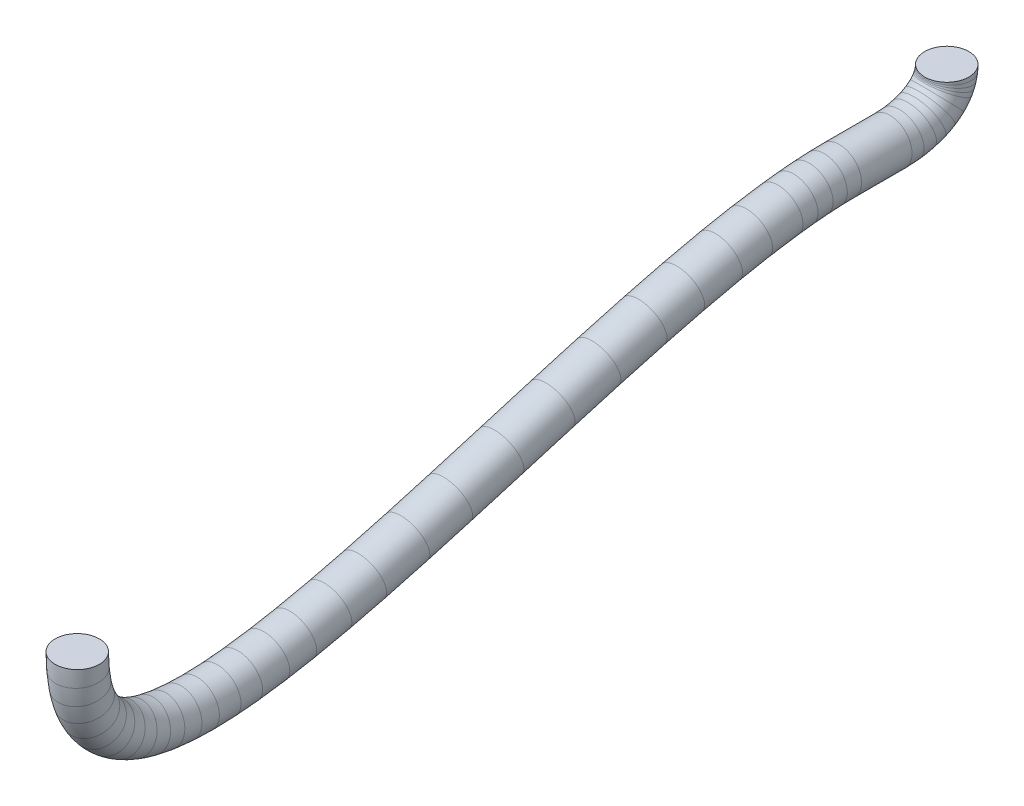
ISO-10303-21;
HEADER;
FILE_DESCRIPTION(('STEP AP214'),'2;1');
FILE_NAME('part.step','',(''),(''),'','','');
FILE_SCHEMA(('AUTOMOTIVE_DESIGN { 1 0 10303 214 1 1 1 1 }'));
ENDSEC;
DATA;
#1=APPLICATION_CONTEXT('core data for automotive mechanical design processes');
#2=APPLICATION_PROTOCOL_DEFINITION('international standard','automotive_design',2000,#1);
#3=PRODUCT_CONTEXT('',#1,'mechanical');
#4=PRODUCT('Part','Part','',(#3));
#5=PRODUCT_RELATED_PRODUCT_CATEGORY('part','',(#4));
#6=PRODUCT_DEFINITION_FORMATION('','',#4);
#7=PRODUCT_DEFINITION_CONTEXT('part definition',#1,'design');
#8=PRODUCT_DEFINITION('design','',#6,#7);
#9=PRODUCT_DEFINITION_SHAPE('','',#8);
#10=(LENGTH_UNIT() NAMED_UNIT(*) SI_UNIT(.MILLI.,.METRE.));
#11=(NAMED_UNIT(*) PLANE_ANGLE_UNIT() SI_UNIT($,.RADIAN.));
#12=(NAMED_UNIT(*) SI_UNIT($,.STERADIAN.) SOLID_ANGLE_UNIT());
#13=UNCERTAINTY_MEASURE_WITH_UNIT(LENGTH_MEASURE(1.E-05),#10,'distance_accuracy_value','');
#14=(GEOMETRIC_REPRESENTATION_CONTEXT(3) GLOBAL_UNCERTAINTY_ASSIGNED_CONTEXT((#13)) GLOBAL_UNIT_ASSIGNED_CONTEXT((#10,
#11,#12)) REPRESENTATION_CONTEXT('',''));
#15=CARTESIAN_POINT('',(0.,0.,0.));
#16=DIRECTION('',(0.,0.,1.));
#17=DIRECTION('',(1.,0.,0.));
#18=AXIS2_PLACEMENT_3D('',#15,#16,#17);
#19=CARTESIAN_POINT('',(0.599683531625097,-230.95,225.510489149716));
#20=DIRECTION('',(0.,-1.,0.));
#21=DIRECTION('',(0.,0.,-1.));
#22=AXIS2_PLACEMENT_3D('',#19,#20,#21);
#23=PLANE('',#22);
#24=CARTESIAN_POINT('',(0.599683531625097,-230.95,225.510489149716));
#25=DIRECTION('',(0.,1.,0.));
#26=DIRECTION('',(0.,0.,-1.));
#27=AXIS2_PLACEMENT_3D('',#24,#25,#26);
#28=CIRCLE('',#27,1.75);
#29=CARTESIAN_POINT('',(0.599683531625097,-230.95,223.760489149716));
#30=VERTEX_POINT('',#29);
#31=EDGE_CURVE('E11',#30,#30,#28,.T.);
#32=ORIENTED_EDGE('',*,*,#31,.T.);
#33=EDGE_LOOP('',(#32));
#34=FACE_BOUND('',#33,.T.);
#35=ADVANCED_FACE('F43',(#34),#23,.F.);
#36=CARTESIAN_POINT('',(0.652273653358251,-230.950000000005,211.445726271844));
#37=DIRECTION('',(0.999993009488198,0.,0.00373911416480584));
#38=DIRECTION('',(-0.00373911416480584,0.,0.999993009488198));
#39=AXIS2_PLACEMENT_3D('',#36,#37,#38);
#40=TOROIDAL_SURFACE('',#39,14.0648611984503,1.75);
#41=ORIENTED_EDGE('',*,*,#31,.F.);
#42=EDGE_LOOP('',(#41));
#43=FACE_BOUND('',#42,.T.);
#44=CARTESIAN_POINT('',(0.599876661505989,-232.154270391325,225.458838271379));
#45=DIRECTION('',(-0.000320152784654025,0.996327639592214,0.0856220303823781));
#46=DIRECTION('',(-1.37312788296879E-05,0.0856220303823781,-0.996327690935393));
#47=AXIS2_PLACEMENT_3D('',#44,#45,#46);
#48=CIRCLE('',#47,1.75);
#49=CARTESIAN_POINT('',(0.599852631768037,-232.004431838156,223.715264812242));
#50=VERTEX_POINT('',#49);
#51=EDGE_CURVE('E53',#50,#50,#48,.T.);
#52=ORIENTED_EDGE('',*,*,#51,.T.);
#53=EDGE_LOOP('',(#52));
#54=FACE_BOUND('',#53,.T.);
#55=ADVANCED_FACE('F310',(#43,#54),#40,.T.);
#56=CARTESIAN_POINT('',(0.637481512229634,-231.277168882739,215.252721544967));
#57=DIRECTION('',(-0.999993210663899,-4.65774382858567E-06,-0.00368491579451425));
#58=DIRECTION('',(0.00368491579455422,0.,-0.999993210674746));
#59=AXIS2_PLACEMENT_3D('',#56,#57,#58);
#60=TOROIDAL_SURFACE('',#59,10.2438049480803,1.75);
#61=CARTESIAN_POINT('',(0.600521501898247,-233.346108992383,225.285351339525));
#62=DIRECTION('',(-0.000748803744928628,0.979391732372712,0.201968497179461));
#63=DIRECTION('',(-7.66801555379996E-05,0.201968496973167,-0.979392015666124));
#64=AXIS2_PLACEMENT_3D('',#61,#62,#63);
#65=CIRCLE('',#64,1.75);
#66=CARTESIAN_POINT('',(0.600387311626055,-232.992664122679,223.571415312109));
#67=VERTEX_POINT('',#66);
#68=EDGE_CURVE('E221',#67,#67,#65,.T.);
#69=ORIENTED_EDGE('',*,*,#68,.T.);
#70=EDGE_LOOP('',(#69));
#71=FACE_BOUND('',#70,.T.);
#72=ORIENTED_EDGE('',*,*,#51,.F.);
#73=EDGE_LOOP('',(#72));
#74=FACE_BOUND('',#73,.T.);
#75=ADVANCED_FACE('F316',(#71,#74),#60,.T.);
#76=CARTESIAN_POINT('',(0.631750574026379,-231.584244505673,216.741780676299));
#77=DIRECTION('',(-0.999993311714176,-1.03364423971567E-05,-0.00365737885266748));
#78=DIRECTION('',(0.00365737885286286,0.,-0.999993311767597));
#79=AXIS2_PLACEMENT_3D('',#76,#77,#78);
#80=TOROIDAL_SURFACE('',#79,8.7234019397249,1.75);
#81=CARTESIAN_POINT('',(0.601714966366488,-234.50311305654,224.962306550417));
#82=DIRECTION('',(-0.00123350720030742,0.94235950622106,0.334599819926412));
#83=DIRECTION('',(-0.000213491057720491,0.334599818690996,-0.942360289779615));
#84=AXIS2_PLACEMENT_3D('',#81,#82,#83);
#85=CIRCLE('',#84,1.75);
#86=CARTESIAN_POINT('',(0.601341357015477,-233.91756337383,223.313176043303));
#87=VERTEX_POINT('',#86);
#88=EDGE_CURVE('E220',#87,#87,#85,.T.);
#89=ORIENTED_EDGE('',*,*,#88,.T.);
#90=EDGE_LOOP('',(#89));
#91=FACE_BOUND('',#90,.T.);
#92=ORIENTED_EDGE('',*,*,#68,.F.);
#93=EDGE_LOOP('',(#92));
#94=FACE_BOUND('',#93,.T.);
#95=ADVANCED_FACE('F586',(#91,#94),#80,.T.);
#96=CARTESIAN_POINT('',(0.624426582612896,-232.255162773185,218.631312993528));
#97=DIRECTION('',(-0.999993525080731,-3.12614918615267E-05,-0.00359844679437807));
#98=DIRECTION('',(0.00359844679613642,0.,-0.999993525569369));
#99=AXIS2_PLACEMENT_3D('',#96,#97,#98);
#100=TOROIDAL_SURFACE('',#99,6.71827922248788,1.75);
#101=CARTESIAN_POINT('',(0.603550296161072,-235.592963501449,224.461744040233));
#102=DIRECTION('',(-0.0018149240154829,0.867851457829194,0.49682044361576));
#103=DIRECTION('',(-0.000486673799911577,0.496820436476968,-0.867853223216603));
#104=AXIS2_PLACEMENT_3D('',#101,#102,#103);
#105=CIRCLE('',#104,1.75);
#106=CARTESIAN_POINT('',(0.602698617011227,-234.723527737614,222.943000899604));
#107=VERTEX_POINT('',#106);
#108=EDGE_CURVE('E222',#107,#107,#105,.T.);
#109=ORIENTED_EDGE('',*,*,#108,.T.);
#110=EDGE_LOOP('',(#109));
#111=FACE_BOUND('',#110,.T.);
#112=ORIENTED_EDGE('',*,*,#88,.F.);
#113=EDGE_LOOP('',(#112));
#114=FACE_BOUND('',#113,.T.);
#115=ADVANCED_FACE('F579',(#111,#114),#100,.T.);
#116=CARTESIAN_POINT('',(0.622465015387702,-232.535265784044,219.120592871893));
#117=DIRECTION('',(-0.999993630358914,-4.81866480562204E-05,-0.00356888212852284));
#118=DIRECTION('',(0.00356888213266623,0.,-0.999993631519883));
#119=AXIS2_PLACEMENT_3D('',#116,#117,#118);
#120=TOROIDAL_SURFACE('',#119,6.1544917662376,1.75);
#121=CARTESIAN_POINT('',(0.605871285254258,-236.504911050862,223.823720555088));
#122=DIRECTION('',(-0.00233875103817929,0.764182831932174,0.644995449304647));
#123=DIRECTION('',(-0.000863792573269664,0.644995428858808,-0.764185939816765));
#124=AXIS2_PLACEMENT_3D('',#121,#122,#123);
#125=CIRCLE('',#124,1.75);
#126=CARTESIAN_POINT('',(0.604359648251036,-235.376169050359,222.486395160409));
#127=VERTEX_POINT('',#126);
#128=EDGE_CURVE('E47',#127,#127,#125,.T.);
#129=ORIENTED_EDGE('',*,*,#128,.T.);
#130=EDGE_LOOP('',(#129));
#131=FACE_BOUND('',#130,.T.);
#132=ORIENTED_EDGE('',*,*,#108,.F.);
#133=EDGE_LOOP('',(#132));
#134=FACE_BOUND('',#133,.T.);
#135=ADVANCED_FACE('F572',(#131,#134),#120,.T.);
#136=CARTESIAN_POINT('',(0.621707328333354,-232.617312423727,219.217797994022));
#137=DIRECTION('',(-0.999993813510165,-9.25674170831454E-05,-0.00351630099256304));
#138=DIRECTION('',(0.00351630100762815,0.,-0.999993817794502));
#139=AXIS2_PLACEMENT_3D('',#136,#137,#138);
#140=TOROIDAL_SURFACE('',#139,6.02728765735467,1.75);
#141=CARTESIAN_POINT('',(0.608732601913135,-237.285396041633,223.030542871039));
#142=DIRECTION('',(-0.00278190190305762,0.63258419529721,0.774486602132008));
#143=DIRECTION('',(-0.00133851675835,0.774486549690048,-0.632588960322651));
#144=AXIS2_PLACEMENT_3D('',#141,#142,#143);
#145=CIRCLE('',#144,1.75);
#146=CARTESIAN_POINT('',(0.606390197586023,-235.930044579675,221.923512190474));
#147=VERTEX_POINT('',#146);
#148=EDGE_CURVE('E73',#147,#147,#145,.T.);
#149=ORIENTED_EDGE('',*,*,#148,.T.);
#150=EDGE_LOOP('',(#149));
#151=FACE_BOUND('',#150,.T.);
#152=ORIENTED_EDGE('',*,*,#128,.F.);
#153=EDGE_LOOP('',(#152));
#154=FACE_BOUND('',#153,.T.);
#155=ADVANCED_FACE('F379',(#151,#154),#140,.T.);
#156=CARTESIAN_POINT('',(0.622317418502923,-232.303180069077,218.96122355487));
#157=DIRECTION('',(-0.99999390069249,-0.000124234865713663,-0.00349043600675036));
#158=DIRECTION('',(0.00349043603368657,0.,-0.999993908409594));
#159=AXIS2_PLACEMENT_3D('',#156,#157,#158);
#160=TOROIDAL_SURFACE('',#159,6.4328858408471,1.75);
#161=CARTESIAN_POINT('',(0.612087032488917,-237.922692494622,222.092197154203));
#162=DIRECTION('',(-0.00310957245162838,0.486716271442068,0.87355457853113));
#163=DIRECTION('',(-0.00185996400491503,0.873554475869836,-0.486722835114275));
#164=AXIS2_PLACEMENT_3D('',#161,#162,#163);
#165=CIRCLE('',#164,1.75);
#166=CARTESIAN_POINT('',(0.608832095480316,-236.393972161849,221.240432192754));
#167=VERTEX_POINT('',#166);
#168=EDGE_CURVE('E81',#167,#167,#165,.T.);
#169=ORIENTED_EDGE('',*,*,#168,.T.);
#170=EDGE_LOOP('',(#169));
#171=FACE_BOUND('',#170,.T.);
#172=ORIENTED_EDGE('',*,*,#148,.F.);
#173=EDGE_LOOP('',(#172));
#174=FACE_BOUND('',#173,.T.);
#175=ADVANCED_FACE('F375',(#171,#174),#160,.T.);
#176=CARTESIAN_POINT('',(0.624180487074776,-230.891989633255,218.174960657567));
#177=DIRECTION('',(-0.999994036353045,-0.000200866190490617,-0.00344774000155362));
#178=DIRECTION('',(0.003447740071107,0.,-0.999994056526539));
#179=AXIS2_PLACEMENT_3D('',#176,#177,#178);
#180=TOROIDAL_SURFACE('',#179,8.04833341425746,1.75);
#181=CARTESIAN_POINT('',(0.615730840923202,-238.404153453979,221.063384809444));
#182=DIRECTION('',(-0.00329014382181626,0.358886232695404,0.933375512286096));
#183=DIRECTION('',(-0.00231270218641395,0.933375337238741,-0.358894317652236));
#184=AXIS2_PLACEMENT_3D('',#181,#182,#183);
#185=CIRCLE('',#184,1.75);
#186=CARTESIAN_POINT('',(0.611683612096978,-236.770746613811,220.435319753552));
#187=VERTEX_POINT('',#186);
#188=EDGE_CURVE('E244',#187,#187,#185,.T.);
#189=ORIENTED_EDGE('',*,*,#188,.T.);
#190=EDGE_LOOP('',(#189));
#191=FACE_BOUND('',#190,.T.);
#192=ORIENTED_EDGE('',*,*,#168,.F.);
#193=EDGE_LOOP('',(#192));
#194=FACE_BOUND('',#193,.T.);
#195=ADVANCED_FACE('F378',(#191,#194),#180,.T.);
#196=CARTESIAN_POINT('',(0.625100312490966,-229.650065899422,217.697439769235));
#197=DIRECTION('',(-0.999994088463878,-0.000248345596694913,-0.00342948418323945));
#198=DIRECTION('',(0.00342948428899709,0.,-0.999994119301464));
#199=AXIS2_PLACEMENT_3D('',#196,#197,#198);
#200=TOROIDAL_SURFACE('',#199,9.37889773446503,1.75);
#201=CARTESIAN_POINT('',(0.619674931683397,-238.757180625647,219.9389023815));
#202=DIRECTION('',(-0.00338945622166507,0.238990554273646,0.971015976467173));
#203=DIRECTION('',(-0.00273322805667371,0.971015713086341,-0.239000030133502));
#204=AXIS2_PLACEMENT_3D('',#201,#202,#203);
#205=CIRCLE('',#204,1.75);
#206=CARTESIAN_POINT('',(0.614891782584218,-237.057903127745,219.520652328766));
#207=VERTEX_POINT('',#206);
#208=EDGE_CURVE('E246',#207,#207,#205,.T.);
#209=ORIENTED_EDGE('',*,*,#208,.T.);
#210=EDGE_LOOP('',(#209));
#211=FACE_BOUND('',#210,.T.);
#212=ORIENTED_EDGE('',*,*,#188,.F.);
#213=EDGE_LOOP('',(#212));
#214=FACE_BOUND('',#213,.T.);
#215=ADVANCED_FACE('F389',(#211,#214),#200,.T.);
#216=CARTESIAN_POINT('',(0.625631100476679,-226.2440051209,216.859127553994));
#217=DIRECTION('',(-0.999994148962456,-0.000361245385868,-0.00340169702135095));
#218=DIRECTION('',(0.00340169724330869,0.,-0.999994214211195));
#219=AXIS2_PLACEMENT_3D('',#216,#217,#218);
#220=TOROIDAL_SURFACE('',#219,12.8866058245246,1.75);
#221=CARTESIAN_POINT('',(0.623694234670729,-238.986389186725,218.781692050762));
#222=DIRECTION('',(-0.00341752111260348,0.149190552002641,0.988802558523486));
#223=DIRECTION('',(-0.00304512418523937,0.98880219573266,-0.14920102188982));
#224=AXIS2_PLACEMENT_3D('',#221,#222,#223);
#225=CIRCLE('',#224,1.75);
#226=CARTESIAN_POINT('',(0.61836526734656,-237.255985344193,218.520590262455));
#227=VERTEX_POINT('',#226);
#228=EDGE_CURVE('E240',#227,#227,#225,.T.);
#229=ORIENTED_EDGE('',*,*,#228,.T.);
#230=EDGE_LOOP('',(#229));
#231=FACE_BOUND('',#230,.T.);
#232=ORIENTED_EDGE('',*,*,#208,.F.);
#233=EDGE_LOOP('',(#232));
#234=FACE_BOUND('',#233,.T.);
#235=ADVANCED_FACE('F392',(#231,#234),#220,.T.);
#236=CARTESIAN_POINT('',(0.624924808056186,-223.881286542038,216.502638081205));
#237=DIRECTION('',(-0.999994157013046,-0.000430210280331358,-0.0033912916243665));
#238=DIRECTION('',(0.00339129193819817,0.,-0.999994249552961));
#239=AXIS2_PLACEMENT_3D('',#236,#237,#238);
#240=TOROIDAL_SURFACE('',#239,15.2760667194476,1.75);
#241=CARTESIAN_POINT('',(0.628401088825607,-239.13026070658,217.412027580586));
#242=DIRECTION('',(-0.00341088763441394,0.0595292239451879,0.998220735780433));
#243=DIRECTION('',(-0.00335324218762274,0.998220249455797,-0.0595406528620355));
#244=AXIS2_PLACEMENT_3D('',#241,#242,#243);
#245=CIRCLE('',#244,1.75);
#246=CARTESIAN_POINT('',(0.622532914997267,-237.383375270033,217.307831438077));
#247=VERTEX_POINT('',#246);
#248=EDGE_CURVE('E239',#247,#247,#245,.T.);
#249=ORIENTED_EDGE('',*,*,#248,.T.);
#250=EDGE_LOOP('',(#249));
#251=FACE_BOUND('',#250,.T.);
#252=ORIENTED_EDGE('',*,*,#228,.F.);
#253=EDGE_LOOP('',(#252));
#254=FACE_BOUND('',#253,.T.);
#255=ADVANCED_FACE('F406',(#251,#254),#240,.T.);
#256=CARTESIAN_POINT('',(0.619666539561004,-217.54798719851,216.124931711478));
#257=DIRECTION('',(-0.999994101300764,-0.000606326155324328,-0.00338078870550779));
#258=DIRECTION('',(0.00338078932695001,0.,-0.999994285115434));
#259=AXIS2_PLACEMENT_3D('',#256,#257,#258);
#260=TOROIDAL_SURFACE('',#259,21.6206202928078,1.75);
#261=CARTESIAN_POINT('',(0.633080857269591,-239.168414852624,216.034654609843));
#262=DIRECTION('',(-0.00337822686232586,-0.00417758227443026,0.999985567590656));
#263=DIRECTION('',(-0.00356969056087941,0.999984952761725,0.00416552030730562));
#264=AXIS2_PLACEMENT_3D('',#261,#262,#263);
#265=CIRCLE('',#264,1.75);
#266=CARTESIAN_POINT('',(0.626833898788052,-237.418441185291,216.041944270381));
#267=VERTEX_POINT('',#266);
#268=EDGE_CURVE('E241',#267,#267,#265,.T.);
#269=ORIENTED_EDGE('',*,*,#268,.T.);
#270=EDGE_LOOP('',(#269));
#271=FACE_BOUND('',#270,.T.);
#272=ORIENTED_EDGE('',*,*,#248,.F.);
#273=EDGE_LOOP('',(#272));
#274=FACE_BOUND('',#273,.T.);
#275=ADVANCED_FACE('F373',(#271,#274),#260,.T.);
#276=CARTESIAN_POINT('',(0.614231723328911,-213.387293714289,216.142295241387));
#277=DIRECTION('',(-0.999994026509214,-0.000716999903687829,-0.00338125080820345));
#278=DIRECTION('',(0.00338125167733548,0.,-0.999994283552208));
#279=AXIS2_PLACEMENT_3D('',#276,#277,#278);
#280=TOROIDAL_SURFACE('',#279,25.7813527369083,1.75);
#281=CARTESIAN_POINT('',(0.638800202803064,-239.104836849559,214.329694783407));
#282=DIRECTION('',(-0.00332247225471225,-0.0703094488919093,0.997519695331692));
#283=DIRECTION('',(-0.00379153006440051,0.99751891664757,0.0702967654307681));
#284=AXIS2_PLACEMENT_3D('',#281,#282,#283);
#285=CIRCLE('',#284,1.75);
#286=CARTESIAN_POINT('',(0.632165025190363,-237.359178745426,214.452714122911));
#287=VERTEX_POINT('',#286);
#288=EDGE_CURVE('E235',#287,#287,#285,.T.);
#289=ORIENTED_EDGE('',*,*,#288,.T.);
#290=EDGE_LOOP('',(#289));
#291=FACE_BOUND('',#290,.T.);
#292=ORIENTED_EDGE('',*,*,#268,.F.);
#293=EDGE_LOOP('',(#292));
#294=FACE_BOUND('',#293,.T.);
#295=ADVANCED_FACE('F369',(#291,#294),#280,.T.);
#296=CARTESIAN_POINT('',(0.592317097736503,-202.110524846985,216.937057086524));
#297=DIRECTION('',(-0.999993695084569,-0.00101668584303605,-0.00340237284938798));
#298=DIRECTION('',(0.00340237460782086,0.,-0.999994211906763));
#299=AXIS2_PLACEMENT_3D('',#296,#297,#298);
#300=TOROIDAL_SURFACE('',#299,37.0861108691996,1.75);
#301=CARTESIAN_POINT('',(0.644419738437475,-238.945704878003,212.63050198994));
#302=DIRECTION('',(-0.0032612910873151,-0.116127173105407,0.993228998593472));
#303=DIRECTION('',(-0.00394305626656438,0.993228052622252,0.116114115384337));
#304=AXIS2_PLACEMENT_3D('',#301,#302,#303);
#305=CIRCLE('',#304,1.75);
#306=CARTESIAN_POINT('',(0.637519389970987,-237.207555785914,212.833701691863));
#307=VERTEX_POINT('',#306);
#308=EDGE_CURVE('E218',#307,#307,#305,.T.);
#309=ORIENTED_EDGE('',*,*,#308,.T.);
#310=EDGE_LOOP('',(#309));
#311=FACE_BOUND('',#310,.T.);
#312=ORIENTED_EDGE('',*,*,#288,.F.);
#313=EDGE_LOOP('',(#312));
#314=FACE_BOUND('',#313,.T.);
#315=ADVANCED_FACE('F372',(#311,#314),#300,.T.);
#316=CARTESIAN_POINT('',(0.573058372760405,-194.742307760652,217.798477175891));
#317=DIRECTION('',(-0.999993396421797,-0.00121389673854435,-0.0034254295360203));
#318=DIRECTION('',(0.00342543205978587,0.,-0.999994133190392));
#319=AXIS2_PLACEMENT_3D('',#316,#317,#318);
#320=TOROIDAL_SURFACE('',#319,44.504532091477,1.75);
#321=CARTESIAN_POINT('',(0.651354979312619,-238.644069832968,210.498988613776));
#322=DIRECTION('',(-0.00317993607564103,-0.164021689833436,0.986451607161111));
#323=DIRECTION('',(-0.0040988880789254,0.98645044581874,0.164008283511915));
#324=AXIS2_PLACEMENT_3D('',#321,#322,#323);
#325=CIRCLE('',#324,1.75);
#326=CARTESIAN_POINT('',(0.6441819251745,-236.917781552785,210.786003109921));
#327=VERTEX_POINT('',#326);
#328=EDGE_CURVE('E216',#327,#327,#325,.T.);
#329=ORIENTED_EDGE('',*,*,#328,.T.);
#330=EDGE_LOOP('',(#329));
#331=FACE_BOUND('',#330,.T.);
#332=ORIENTED_EDGE('',*,*,#308,.F.);
#333=EDGE_LOOP('',(#332));
#334=FACE_BOUND('',#333,.T.);
#335=ADVANCED_FACE('F407',(#331,#334),#320,.T.);
#336=CARTESIAN_POINT('',(0.498285050320689,-174.113387852091,221.228298267948));
#337=DIRECTION('',(-0.999992206360794,-0.00178666119663753,-0.00352066178998288));
#338=DIRECTION('',(0.00352066740925109,0.,-0.999993802431292));
#339=AXIS2_PLACEMENT_3D('',#336,#337,#338);
#340=TOROIDAL_SURFACE('',#339,65.4167442859653,1.75);
#341=CARTESIAN_POINT('',(0.658117860446582,-238.256009454482,208.381159270464));
#342=DIRECTION('',(-0.00310120894068885,-0.19639622437575,0.980519711966086));
#343=DIRECTION('',(-0.00420226941875658,0.980518328860248,0.196382656313737));
#344=AXIS2_PLACEMENT_3D('',#341,#342,#343);
#345=CIRCLE('',#344,1.75);
#346=CARTESIAN_POINT('',(0.650763888963758,-236.540102378977,208.724828919013));
#347=VERTEX_POINT('',#346);
#348=EDGE_CURVE('E219',#347,#347,#345,.T.);
#349=ORIENTED_EDGE('',*,*,#348,.T.);
#350=EDGE_LOOP('',(#349));
#351=FACE_BOUND('',#350,.T.);
#352=ORIENTED_EDGE('',*,*,#328,.F.);
#353=EDGE_LOOP('',(#352));
#354=FACE_BOUND('',#353,.T.);
#355=ADVANCED_FACE('F347',(#351,#354),#340,.T.);
#356=CARTESIAN_POINT('',(0.428217155686936,-159.723549888482,224.110333698434));
#357=DIRECTION('',(-0.999991071498182,-0.00220548413444708,-0.00360454763461999));
#358=DIRECTION('',(0.00360455640120066,0.,-0.999993503565473));
#359=AXIS2_PLACEMENT_3D('',#356,#357,#358);
#360=TOROIDAL_SURFACE('',#359,80.0924902097886,1.75);
#361=CARTESIAN_POINT('',(0.66673087911017,-237.652696931726,205.622550155749));
#362=DIRECTION('',(-0.00299809393776102,-0.230839098149282,0.972987318621557));
#363=DIRECTION('',(-0.00430980772855443,0.972985637766547,0.230825419435055));
#364=AXIS2_PLACEMENT_3D('',#361,#362,#363);
#365=CIRCLE('',#364,1.75);
#366=CARTESIAN_POINT('',(0.6591887155852,-235.949972065635,206.02649463976));
#367=VERTEX_POINT('',#366);
#368=EDGE_CURVE('E180',#367,#367,#365,.T.);
#369=ORIENTED_EDGE('',*,*,#368,.T.);
#370=EDGE_LOOP('',(#369));
#371=FACE_BOUND('',#370,.T.);
#372=ORIENTED_EDGE('',*,*,#348,.F.);
#373=EDGE_LOOP('',(#372));
#374=FACE_BOUND('',#373,.T.);
#375=ADVANCED_FACE('F343',(#371,#374),#360,.T.);
#376=CARTESIAN_POINT('',(0.102380615884724,-114.103596334305,234.932563182757));
#377=DIRECTION('',(-0.99998562916645,-0.00363233224022014,-0.00394304743519032));
#378=DIRECTION('',(0.00394307344741129,0.,-0.999992226055677));
#379=AXIS2_PLACEMENT_3D('',#376,#377,#378);
#380=TOROIDAL_SURFACE('',#379,126.979429882539,1.75);
#381=CARTESIAN_POINT('',(0.675057663407165,-236.970270945531,202.882166550685));
#382=DIRECTION('',(-0.00289851228295659,-0.252420365752298,0.96761333061302));
#383=DIRECTION('',(-0.00437538357992854,0.967611334380205,0.252406738415376));
#384=AXIS2_PLACEMENT_3D('',#381,#382,#383);
#385=CIRCLE('',#384,1.75);
#386=CARTESIAN_POINT('',(0.66740074214229,-235.276951110365,203.323878342912));
#387=VERTEX_POINT('',#386);
#388=EDGE_CURVE('E175',#387,#387,#385,.T.);
#389=ORIENTED_EDGE('',*,*,#388,.T.);
#390=EDGE_LOOP('',(#389));
#391=FACE_BOUND('',#390,.T.);
#392=ORIENTED_EDGE('',*,*,#368,.F.);
#393=EDGE_LOOP('',(#392));
#394=FACE_BOUND('',#393,.T.);
#395=ADVANCED_FACE('F346',(#391,#394),#380,.T.);
#396=CARTESIAN_POINT('',(-0.275809855799114,-77.7286862257471,244.420518374792));
#397=DIRECTION('',(-0.999979107659913,-0.00485908028752361,-0.00426304849173148));
#398=DIRECTION('',(-0.00485912444157354,0.999988194385145,0.));
#399=AXIS2_PLACEMENT_3D('',#396,#397,#398);
#400=TOROIDAL_SURFACE('',#399,164.572844434829,1.75);
#401=CARTESIAN_POINT('',(0.685040802634319,-236.045529052169,199.486398055635));
#402=DIRECTION('',(-0.00277429658164064,-0.273054025696429,0.961994699740831));
#403=DIRECTION('',(-0.00443604443466401,0.961992296882611,0.273040550556675));
#404=AXIS2_PLACEMENT_3D('',#401,#402,#403);
#405=CIRCLE('',#404,1.75);
#406=CARTESIAN_POINT('',(0.677277724873657,-234.362042532624,199.964219019109));
#407=VERTEX_POINT('',#406);
#408=EDGE_CURVE('E215',#407,#407,#405,.T.);
#409=ORIENTED_EDGE('',*,*,#408,.T.);
#410=EDGE_LOOP('',(#409));
#411=FACE_BOUND('',#410,.T.);
#412=ORIENTED_EDGE('',*,*,#388,.F.);
#413=EDGE_LOOP('',(#412));
#414=FACE_BOUND('',#413,.T.);
#415=ADVANCED_FACE('F397',(#411,#414),#400,.T.);
#416=CARTESIAN_POINT('',(-3.44396475529917,89.0727580795834,291.756555122141));
#417=DIRECTION('',(-0.999921525959788,-0.0109949111489383,-0.00600448591278886));
#418=DIRECTION('',(-0.0109951093587426,0.999939551958112,0.));
#419=AXIS2_PLACEMENT_3D('',#416,#417,#418);
#420=TOROIDAL_SURFACE('',#419,337.983329765626,1.75);
#421=CARTESIAN_POINT('',(0.69458120167252,-235.066873463844,196.105612106856));
#422=DIRECTION('',(-0.0026469300489663,-0.283056228859461,0.959099663781182));
#423=DIRECTION('',(-0.00446427100503674,0.959096810988958,0.283043066396627));
#424=AXIS2_PLACEMENT_3D('',#421,#422,#423);
#425=CIRCLE('',#424,1.75);
#426=CARTESIAN_POINT('',(0.686768727413706,-233.388454044613,196.600937473051));
#427=VERTEX_POINT('',#426);
#428=EDGE_CURVE('E223',#427,#427,#425,.T.);
#429=ORIENTED_EDGE('',*,*,#428,.T.);
#430=EDGE_LOOP('',(#429));
#431=FACE_BOUND('',#430,.T.);
#432=ORIENTED_EDGE('',*,*,#408,.F.);
#433=EDGE_LOOP('',(#432));
#434=FACE_BOUND('',#433,.T.);
#435=ADVANCED_FACE('F400',(#431,#434),#420,.T.);
#436=CARTESIAN_POINT('',(-13.5183888657135,355.329602431087,370.308341574124));
#437=DIRECTION('',(-0.999730040402079,-0.0213903351987662,-0.00907192800578628));
#438=DIRECTION('',(-0.0213912154640868,0.999771181771594,0.));
#439=AXIS2_PLACEMENT_3D('',#436,#437,#438);
#440=TOROIDAL_SURFACE('',#439,615.724449913381,1.75);
#441=CARTESIAN_POINT('',(0.705425606837465,-233.857557541671,192.059156874106));
#442=DIRECTION('',(-0.00248853799422293,-0.289626475068708,0.957136516970242));
#443=DIRECTION('',(-0.00448188038385124,0.957133097732608,0.289613787608614));
#444=AXIS2_PLACEMENT_3D('',#441,#442,#443);
#445=CIRCLE('',#444,1.75);
#446=CARTESIAN_POINT('',(0.697582316165725,-232.182574620639,192.565981002421));
#447=VERTEX_POINT('',#446);
#448=EDGE_CURVE('E212',#447,#447,#445,.T.);
#449=ORIENTED_EDGE('',*,*,#448,.T.);
#450=EDGE_LOOP('',(#449));
#451=FACE_BOUND('',#450,.T.);
#452=ORIENTED_EDGE('',*,*,#428,.F.);
#453=EDGE_LOOP('',(#452));
#454=FACE_BOUND('',#453,.T.);
#455=ADVANCED_FACE('F355',(#451,#454),#440,.T.);
#456=CARTESIAN_POINT('',(-35.6085303581631,-1114.25780378808,-74.4415816393448));
#457=DIRECTION('',(0.999218552525222,-0.0384768970198325,-0.00904503649108143));
#458=DIRECTION('',(-0.038478471065546,-0.999259429409829,0.));
#459=AXIS2_PLACEMENT_3D('',#456,#457,#458);
#460=TOROIDAL_SURFACE('',#459,920.568270481217,1.75);
#461=CARTESIAN_POINT('',(0.715553329221815,-232.643638914355,188.0140638611));
#462=DIRECTION('',(-0.00230753831074346,-0.285235882312825,0.958454572062844));
#463=DIRECTION('',(-0.00447088940409932,0.958450487225253,0.28522390272488));
#464=AXIS2_PLACEMENT_3D('',#461,#462,#463);
#465=CIRCLE('',#464,1.75);
#466=CARTESIAN_POINT('',(0.707729272764641,-230.966350561711,188.513205690869));
#467=VERTEX_POINT('',#466);
#468=EDGE_CURVE('E209',#467,#467,#465,.T.);
#469=ORIENTED_EDGE('',*,*,#468,.T.);
#470=EDGE_LOOP('',(#469));
#471=FACE_BOUND('',#470,.T.);
#472=ORIENTED_EDGE('',*,*,#448,.F.);
#473=EDGE_LOOP('',(#472));
#474=FACE_BOUND('',#473,.T.);
#475=ADVANCED_FACE('F352',(#471,#474),#460,.T.);
#476=CARTESIAN_POINT('',(-7.79880427726526,-641.552471549713,66.3023810452588));
#477=DIRECTION('',(0.999798258505332,-0.0197820976124579,-0.00348007237817445));
#478=DIRECTION('',(-0.0197822174030861,-0.999804312790567,0.));
#479=AXIS2_PLACEMENT_3D('',#476,#477,#478);
#480=TOROIDAL_SURFACE('',#479,426.723167201555,1.75);
#481=CARTESIAN_POINT('',(0.723944393134767,-231.581149489818,184.38514553733));
#482=DIRECTION('',(-0.00213064339992358,-0.276733515209951,0.960944338616054));
#483=DIRECTION('',(-0.004451231317375,0.96093962441545,0.276722288166408));
#484=AXIS2_PLACEMENT_3D('',#481,#482,#483);
#485=CIRCLE('',#484,1.75);
#486=CARTESIAN_POINT('',(0.716154738329361,-229.899505147091,184.869409541622));
#487=VERTEX_POINT('',#486);
#488=EDGE_CURVE('E213',#487,#487,#485,.T.);
#489=ORIENTED_EDGE('',*,*,#488,.T.);
#490=EDGE_LOOP('',(#489));
#491=FACE_BOUND('',#490,.T.);
#492=ORIENTED_EDGE('',*,*,#468,.F.);
#493=EDGE_LOOP('',(#492));
#494=FACE_BOUND('',#493,.T.);
#495=ADVANCED_FACE('F45',(#491,#494),#480,.T.);
#496=CARTESIAN_POINT('',(-1.44541849030121,-417.123848616214,130.947601419607));
#497=DIRECTION('',(0.999934620058354,-0.0113854473063844,-0.00106169599606506));
#498=DIRECTION('',(-0.0113854537232188,-0.999935183621177,0.));
#499=AXIS2_PLACEMENT_3D('',#496,#497,#498);
#500=TOROIDAL_SURFACE('',#499,193.096790381822,1.75);
#501=CARTESIAN_POINT('',(0.731584332555901,-230.57040721846,180.741623321092));
#502=DIRECTION('',(-0.00191025531816923,-0.257865900246124,0.966178828382653));
#503=DIRECTION('',(-0.00441167084872725,0.966173361979714,0.25785571888391));
#504=AXIS2_PLACEMENT_3D('',#501,#502,#503);
#505=CIRCLE('',#504,1.75);
#506=CARTESIAN_POINT('',(0.723863908570628,-228.879603834995,181.192870829139));
#507=VERTEX_POINT('',#506);
#508=EDGE_CURVE('E267',#507,#507,#505,.T.);
#509=ORIENTED_EDGE('',*,*,#508,.T.);
#510=EDGE_LOOP('',(#509));
#511=FACE_BOUND('',#510,.T.);
#512=ORIENTED_EDGE('',*,*,#488,.F.);
#513=EDGE_LOOP('',(#512));
#514=FACE_BOUND('',#513,.T.);
#515=ADVANCED_FACE('F393',(#511,#514),#500,.T.);
#516=CARTESIAN_POINT('',(-0.715875991560017,-373.935424228065,142.475711144457));
#517=DIRECTION('',(0.999950600432144,-0.00991706168996644,-0.000669763266475202));
#518=DIRECTION('',(-0.00991706391427901,-0.999950824712556,0.));
#519=AXIS2_PLACEMENT_3D('',#516,#517,#518);
#520=TOROIDAL_SURFACE('',#519,148.391048511237,1.75);
#521=CARTESIAN_POINT('',(0.737153798763957,-229.80738488291,177.758855239257));
#522=DIRECTION('',(-0.00170747125735035,-0.237766190498929,0.971320916688986));
#523=DIRECTION('',(-0.00437414225500642,0.971314816144453,0.237757007925739));
#524=AXIS2_PLACEMENT_3D('',#521,#522,#523);
#525=CIRCLE('',#524,1.75);
#526=CARTESIAN_POINT('',(0.729499049817696,-228.107583954658,178.174930003127));
#527=VERTEX_POINT('',#526);
#528=EDGE_CURVE('E250',#527,#527,#525,.T.);
#529=ORIENTED_EDGE('',*,*,#528,.T.);
#530=EDGE_LOOP('',(#529));
#531=FACE_BOUND('',#530,.T.);
#532=ORIENTED_EDGE('',*,*,#508,.F.);
#533=EDGE_LOOP('',(#532));
#534=FACE_BOUND('',#533,.T.);
#535=ADVANCED_FACE('F336',(#531,#534),#520,.T.);
#536=CARTESIAN_POINT('',(-0.0314718690054481,-321.787684946431,155.241973766323));
#537=DIRECTION('',(0.999965603065638,-0.00828969473064047,-0.000271379526992458));
#538=DIRECTION('',(-0.00828969503589542,-0.999965639887797,0.));
#539=AXIS2_PLACEMENT_3D('',#536,#537,#538);
#540=TOROIDAL_SURFACE('',#539,94.6993998738033,1.75);
#541=CARTESIAN_POINT('',(0.742003536671358,-229.124103256355,174.757062816132));
#542=DIRECTION('',(-0.00144274548812184,-0.206069180184726,0.978536361850418));
#543=DIRECTION('',(-0.00432293433189365,0.978529522106939,0.206061366111961));
#544=AXIS2_PLACEMENT_3D('',#541,#542,#543);
#545=CIRCLE('',#544,1.75);
#546=CARTESIAN_POINT('',(0.734438401590544,-227.411676592668,175.117670206827));
#547=VERTEX_POINT('',#546);
#548=EDGE_CURVE('E248',#547,#547,#545,.T.);
#549=ORIENTED_EDGE('',*,*,#548,.T.);
#550=EDGE_LOOP('',(#549));
#551=FACE_BOUND('',#550,.T.);
#552=ORIENTED_EDGE('',*,*,#528,.F.);
#553=EDGE_LOOP('',(#552));
#554=FACE_BOUND('',#553,.T.);
#555=ADVANCED_FACE('F332',(#551,#554),#540,.T.);
#556=CARTESIAN_POINT('',(0.142820268215531,-305.379575216315,158.697601284592));
#557=DIRECTION('',(0.999969400813684,-0.00782097325706333,-0.000172666251998598));
#558=DIRECTION('',(-0.00782097337364915,-0.999969415720045,0.));
#559=AXIS2_PLACEMENT_3D('',#556,#557,#558);
#560=TOROIDAL_SURFACE('',#559,77.9304967846894,1.75);
#561=CARTESIAN_POINT('',(0.745229663715145,-228.658740045124,172.361893533502));
#562=DIRECTION('',(-0.00120133925816966,-0.175335442634299,0.984508018931396));
#563=DIRECTION('',(-0.00428153982724607,0.984500607358275,0.175328898154));
#564=AXIS2_PLACEMENT_3D('',#561,#562,#563);
#565=CIRCLE('',#564,1.75);
#566=CARTESIAN_POINT('',(0.737736969017464,-226.935863982247,172.668719105271));
#567=VERTEX_POINT('',#566);
#568=EDGE_CURVE('E251',#567,#567,#565,.T.);
#569=ORIENTED_EDGE('',*,*,#568,.T.);
#570=EDGE_LOOP('',(#569));
#571=FACE_BOUND('',#570,.T.);
#572=ORIENTED_EDGE('',*,*,#548,.F.);
#573=EDGE_LOOP('',(#572));
#574=FACE_BOUND('',#573,.T.);
#575=ADVANCED_FACE('F335',(#571,#574),#560,.T.);
#576=CARTESIAN_POINT('',(0.363758998176454,-281.663137843359,162.921637439585));
#577=DIRECTION('',(0.99997417743494,-0.00718616105393739,-5.96038748244959E-05));
#578=DIRECTION('',(-0.00718616106670224,-0.999974179211205,0.));
#579=AXIS2_PLACEMENT_3D('',#576,#577,#578);
#580=TOROIDAL_SURFACE('',#579,53.8398564349954,1.75);
#581=CARTESIAN_POINT('',(0.747768112026203,-228.285511202926,169.950979668833));
#582=DIRECTION('',(-0.000879134439053659,-0.130557250101444,0.991440382256335));
#583=DIRECTION('',(-0.0042343947475809,0.991432363038369,0.130552439353988));
#584=AXIS2_PLACEMENT_3D('',#581,#582,#583);
#585=CIRCLE('',#584,1.75);
#586=CARTESIAN_POINT('',(0.740357921217936,-226.550504567608,170.179446437702));
#587=VERTEX_POINT('',#586);
#588=EDGE_CURVE('E252',#587,#587,#585,.T.);
#589=ORIENTED_EDGE('',*,*,#588,.T.);
#590=EDGE_LOOP('',(#589));
#591=FACE_BOUND('',#590,.T.);
#592=ORIENTED_EDGE('',*,*,#568,.F.);
#593=EDGE_LOOP('',(#592));
#594=FACE_BOUND('',#593,.T.);
#595=ADVANCED_FACE('F306',(#591,#594),#580,.T.);
#596=CARTESIAN_POINT('',(0.424954868506347,-274.362248299562,163.883105096761));
#597=DIRECTION('',(0.99997549082571,-0.00700117888509348,-3.52434408930291E-05));
#598=DIRECTION('',(-0.00700117888944157,-0.999975491446745,0.));
#599=AXIS2_PLACEMENT_3D('',#596,#597,#598);
#600=TOROIDAL_SURFACE('',#599,46.4756819388936,1.75);
#601=CARTESIAN_POINT('',(0.748716377220332,-228.144065050298,168.757910457807));
#602=DIRECTION('',(-0.000699301122593709,-0.104887052555281,0.994483894884279));
#603=DIRECTION('',(-0.00421399255252271,0.994475617197651,0.104883216322342));
#604=AXIS2_PLACEMENT_3D('',#601,#602,#603);
#605=CIRCLE('',#604,1.75);
#606=CARTESIAN_POINT('',(0.741341890253417,-226.403732720202,168.941456086372));
#607=VERTEX_POINT('',#606);
#608=EDGE_CURVE('E254',#607,#607,#605,.T.);
#609=ORIENTED_EDGE('',*,*,#608,.T.);
#610=EDGE_LOOP('',(#609));
#611=FACE_BOUND('',#610,.T.);
#612=ORIENTED_EDGE('',*,*,#588,.F.);
#613=EDGE_LOOP('',(#612));
#614=FACE_BOUND('',#613,.T.);
#615=ADVANCED_FACE('F290',(#611,#614),#600,.T.);
#616=CARTESIAN_POINT('',(0.492426596341244,-265.878820092572,164.777889786392));
#617=DIRECTION('',(0.999976945238763,-0.00679034769281514,-1.3006299063893E-05));
#618=DIRECTION('',(-0.00679034769338948,-0.999976945323342,0.));
#619=AXIS2_PLACEMENT_3D('',#616,#617,#618);
#620=TOROIDAL_SURFACE('',#619,37.9449336156634,1.75);
#621=CARTESIAN_POINT('',(0.749427939780997,-228.036985201769,167.561317440163));
#622=DIRECTION('',(-0.000485130887604139,-0.0733527920570824,0.997305937285772));
#623=DIRECTION('',(-0.0041952411754242,0.997297427577249,0.0733501254210427));
#624=AXIS2_PLACEMENT_3D('',#621,#622,#623);
#625=CIRCLE('',#624,1.75);
#626=CARTESIAN_POINT('',(0.742086267724005,-226.291714703509,167.68968015965));
#627=VERTEX_POINT('',#626);
#628=EDGE_CURVE('E258',#627,#627,#625,.T.);
#629=ORIENTED_EDGE('',*,*,#628,.T.);
#630=EDGE_LOOP('',(#629));
#631=FACE_BOUND('',#630,.T.);
#632=ORIENTED_EDGE('',*,*,#608,.F.);
#633=EDGE_LOOP('',(#632));
#634=FACE_BOUND('',#633,.T.);
#635=ADVANCED_FACE('F293',(#631,#634),#620,.T.);
#636=CARTESIAN_POINT('',(0.520433086113548,-262.209328470001,165.047797978738));
#637=DIRECTION('',(0.999977551017322,-0.006700553739807,-6.40157447671068E-06));
#638=DIRECTION('',(-0.00670055373994429,-0.999977551037811,0.));
#639=AXIS2_PLACEMENT_3D('',#636,#637,#638);
#640=TOROIDAL_SURFACE('',#639,34.2654237266635,1.75);
#641=CARTESIAN_POINT('',(0.749850611355184,-227.972832048576,166.436662101938));
#642=DIRECTION('',(-0.000265194187744622,-0.0405316573434778,0.999178219550964));
#643=DIRECTION('',(-0.00418290668427708,0.999169558443014,0.0405301958108187));
#644=AXIS2_PLACEMENT_3D('',#641,#642,#643);
#645=CIRCLE('',#644,1.75);
#646=CARTESIAN_POINT('',(0.742530524657699,-226.224285321301,166.507589944607));
#647=VERTEX_POINT('',#646);
#648=EDGE_CURVE('E207',#647,#647,#645,.T.);
#649=ORIENTED_EDGE('',*,*,#648,.T.);
#650=EDGE_LOOP('',(#649));
#651=FACE_BOUND('',#650,.T.);
#652=ORIENTED_EDGE('',*,*,#628,.F.);
#653=EDGE_LOOP('',(#652));
#654=FACE_BOUND('',#653,.T.);
#655=ADVANCED_FACE('F295',(#651,#654),#640,.T.);
#656=CARTESIAN_POINT('',(0.568213437477727,-255.733831469512,165.310489149836));
#657=DIRECTION('',(0.999978595980468,-0.00654275025757399,0.));
#658=DIRECTION('',(-0.00654275025757399,-0.999978595980468,0.));
#659=AXIS2_PLACEMENT_3D('',#656,#657,#658);
#660=TOROIDAL_SURFACE('',#659,27.7844263289739,1.75);
#661=CARTESIAN_POINT('',(0.749999999998167,-227.949999838942,165.31048914986));
#662=DIRECTION('',(0.,0.,1.));
#663=DIRECTION('',(-0.00417753028899024,0.999991274082272,0.));
#664=AXIS2_PLACEMENT_3D('',#661,#662,#663);
#665=CIRCLE('',#664,1.75);
#666=CARTESIAN_POINT('',(0.742689321992434,-226.200015109298,165.31048914986));
#667=VERTEX_POINT('',#666);
#668=EDGE_CURVE('E282',#667,#667,#665,.T.);
#669=ORIENTED_EDGE('',*,*,#668,.T.);
#670=EDGE_LOOP('',(#669));
#671=FACE_BOUND('',#670,.T.);
#672=ORIENTED_EDGE('',*,*,#648,.F.);
#673=EDGE_LOOP('',(#672));
#674=FACE_BOUND('',#673,.T.);
#675=ADVANCED_FACE('F303',(#671,#674),#660,.T.);
#676=CARTESIAN_POINT('',(0.749999999997917,-224.94999983895,156.810489149858));
#677=DIRECTION('',(0.,1.,0.));
#678=DIRECTION('',(0.,0.,-1.));
#679=AXIS2_PLACEMENT_3D('',#676,#677,#678);
#680=PLANE('',#679);
#681=CARTESIAN_POINT('',(0.749999999997917,-224.94999983895,156.810489149858));
#682=DIRECTION('',(0.,-1.,0.));
#683=DIRECTION('',(1.,0.,0.));
#684=AXIS2_PLACEMENT_3D('',#681,#682,#683);
#685=CIRCLE('',#684,1.75);
#686=CARTESIAN_POINT('',(2.49999999999792,-224.94999983895,156.810489149858));
#687=VERTEX_POINT('',#686);
#688=EDGE_CURVE('E238',#687,#687,#685,.T.);
#689=ORIENTED_EDGE('',*,*,#688,.F.);
#690=EDGE_LOOP('',(#689));
#691=FACE_BOUND('',#690,.T.);
#692=ADVANCED_FACE('F338',(#691),#680,.T.);
#693=CARTESIAN_POINT('',(0.749999999997917,-227.949999838949,161.310489149859));
#694=DIRECTION('',(0.,0.,1.));
#695=DIRECTION('',(-1.,0.,0.));
#696=AXIS2_PLACEMENT_3D('',#693,#694,#695);
#697=CYLINDRICAL_SURFACE('',#696,1.75);
#698=ORIENTED_EDGE('',*,*,#668,.F.);
#699=EDGE_LOOP('',(#698));
#700=FACE_BOUND('',#699,.T.);
#701=CARTESIAN_POINT('',(0.749999999997917,-227.949999838949,161.310489149859));
#702=DIRECTION('',(0.,0.,1.));
#703=DIRECTION('',(1.,0.,0.));
#704=AXIS2_PLACEMENT_3D('',#701,#702,#703);
#705=CIRCLE('',#704,1.75);
#706=CARTESIAN_POINT('',(2.49999999999792,-227.949999838949,161.310489149859));
#707=VERTEX_POINT('',#706);
#708=EDGE_CURVE('E275',#707,#707,#705,.T.);
#709=ORIENTED_EDGE('',*,*,#708,.T.);
#710=EDGE_LOOP('',(#709));
#711=FACE_BOUND('',#710,.T.);
#712=ADVANCED_FACE('F341',(#700,#711),#697,.T.);
#713=CARTESIAN_POINT('',(0.749999999997917,-220.205305988971,161.310489149857));
#714=DIRECTION('',(-1.,0.,0.));
#715=DIRECTION('',(0.,0.,-1.));
#716=AXIS2_PLACEMENT_3D('',#713,#714,#715);
#717=TOROIDAL_SURFACE('',#716,7.74469384997811,1.75);
#718=CARTESIAN_POINT('',(0.749999999997917,-227.891785257086,160.36269207731));
#719=DIRECTION('',(0.,-0.12238018582888,0.992483294628423));
#720=DIRECTION('',(1.,0.,0.));
#721=AXIS2_PLACEMENT_3D('',#718,#719,#720);
#722=CIRCLE('',#721,1.75);
#723=CARTESIAN_POINT('',(2.49999999999792,-227.891785257086,160.36269207731));
#724=VERTEX_POINT('',#723);
#725=EDGE_CURVE('E128',#724,#724,#722,.T.);
#726=ORIENTED_EDGE('',*,*,#725,.T.);
#727=EDGE_LOOP('',(#726));
#728=FACE_BOUND('',#727,.T.);
#729=ORIENTED_EDGE('',*,*,#708,.F.);
#730=EDGE_LOOP('',(#729));
#731=FACE_BOUND('',#730,.T.);
#732=ADVANCED_FACE('F331',(#728,#731),#717,.T.);
#733=CARTESIAN_POINT('',(0.749999999997917,-221.440613930527,161.158166973495));
#734=DIRECTION('',(-1.,0.,0.));
#735=DIRECTION('',(0.,0.,-1.));
#736=AXIS2_PLACEMENT_3D('',#733,#734,#735);
#737=TOROIDAL_SURFACE('',#736,6.50003013801245,1.75);
#738=CARTESIAN_POINT('',(0.749999999997917,-227.707244246766,159.431975711013));
#739=DIRECTION('',(0.,-0.265566655204551,0.9640925016011));
#740=DIRECTION('',(1.,0.,0.));
#741=AXIS2_PLACEMENT_3D('',#738,#739,#740);
#742=CIRCLE('',#741,1.75);
#743=CARTESIAN_POINT('',(2.49999999999792,-227.707244246766,159.431975711013));
#744=VERTEX_POINT('',#743);
#745=EDGE_CURVE('E137',#744,#744,#742,.T.);
#746=ORIENTED_EDGE('',*,*,#745,.T.);
#747=EDGE_LOOP('',(#746));
#748=FACE_BOUND('',#747,.T.);
#749=ORIENTED_EDGE('',*,*,#725,.F.);
#750=EDGE_LOOP('',(#749));
#751=FACE_BOUND('',#750,.T.);
#752=ADVANCED_FACE('F327',(#748,#751),#737,.T.);
#753=CARTESIAN_POINT('',(0.749999999997917,-222.199241247956,160.949197275147));
#754=DIRECTION('',(-1.,0.,0.));
#755=DIRECTION('',(0.,0.,-1.));
#756=AXIS2_PLACEMENT_3D('',#753,#754,#755);
#757=TOROIDAL_SURFACE('',#756,5.71314784593998,1.75);
#758=CARTESIAN_POINT('',(0.749999999997917,-227.474199901937,158.754916183682));
#759=DIRECTION('',(0.,-0.384075670827617,0.923301618691485));
#760=DIRECTION('',(1.,0.,0.));
#761=AXIS2_PLACEMENT_3D('',#758,#759,#760);
#762=CIRCLE('',#761,1.75);
#763=CARTESIAN_POINT('',(2.49999999999792,-227.474199901937,158.754916183682));
#764=VERTEX_POINT('',#763);
#765=EDGE_CURVE('E201',#764,#764,#762,.T.);
#766=ORIENTED_EDGE('',*,*,#765,.T.);
#767=EDGE_LOOP('',(#766));
#768=FACE_BOUND('',#767,.T.);
#769=ORIENTED_EDGE('',*,*,#745,.F.);
#770=EDGE_LOOP('',(#769));
#771=FACE_BOUND('',#770,.T.);
#772=ADVANCED_FACE('F330',(#768,#771),#757,.T.);
#773=CARTESIAN_POINT('',(0.749999999997917,-223.586192797706,160.37225217282));
#774=DIRECTION('',(-1.,0.,0.));
#775=DIRECTION('',(0.,0.,-1.));
#776=AXIS2_PLACEMENT_3D('',#773,#774,#775);
#777=TOROIDAL_SURFACE('',#776,4.21098265780242,1.75);
#778=CARTESIAN_POINT('',(0.749999999997917,-227.144603939793,158.120567228565));
#779=DIRECTION('',(0.,-0.534717220951684,0.845031060741384));
#780=DIRECTION('',(1.,0.,0.));
#781=AXIS2_PLACEMENT_3D('',#778,#779,#780);
#782=CIRCLE('',#781,1.75);
#783=CARTESIAN_POINT('',(2.49999999999792,-227.144603939793,158.120567228565));
#784=VERTEX_POINT('',#783);
#785=EDGE_CURVE('E198',#784,#784,#782,.T.);
#786=ORIENTED_EDGE('',*,*,#785,.T.);
#787=EDGE_LOOP('',(#786));
#788=FACE_BOUND('',#787,.T.);
#789=ORIENTED_EDGE('',*,*,#765,.F.);
#790=EDGE_LOOP('',(#789));
#791=FACE_BOUND('',#790,.T.);
#792=ADVANCED_FACE('F350',(#788,#791),#777,.T.);
#793=CARTESIAN_POINT('',(0.749999999997917,-224.175188521684,159.999548527584));
#794=DIRECTION('',(-1.,0.,0.));
#795=DIRECTION('',(0.,0.,-1.));
#796=AXIS2_PLACEMENT_3D('',#793,#794,#795);
#797=TOROIDAL_SURFACE('',#796,3.51397191897811,1.75);
#798=CARTESIAN_POINT('',(0.749999999997917,-226.722978671786,157.57947332247));
#799=DIRECTION('',(0.,-0.688700781028709,0.725045677326916));
#800=DIRECTION('',(1.,0.,0.));
#801=AXIS2_PLACEMENT_3D('',#798,#799,#800);
#802=CIRCLE('',#801,1.75);
#803=CARTESIAN_POINT('',(2.49999999999792,-226.722978671786,157.57947332247));
#804=VERTEX_POINT('',#803);
#805=EDGE_CURVE('E194',#804,#804,#802,.T.);
#806=ORIENTED_EDGE('',*,*,#805,.T.);
#807=EDGE_LOOP('',(#806));
#808=FACE_BOUND('',#807,.T.);
#809=ORIENTED_EDGE('',*,*,#785,.F.);
#810=EDGE_LOOP('',(#809));
#811=FACE_BOUND('',#810,.T.);
#812=ADVANCED_FACE('F195',(#808,#811),#797,.T.);
#813=CARTESIAN_POINT('',(0.749999999997917,-224.860502449769,159.348587833267));
#814=DIRECTION('',(-1.,0.,0.));
#815=DIRECTION('',(0.,0.,-1.));
#816=AXIS2_PLACEMENT_3D('',#813,#814,#815);
#817=TOROIDAL_SURFACE('',#816,2.56877087921325,1.75);
#818=CARTESIAN_POINT('',(0.749999999997917,-226.190818557395,157.151125004529));
#819=DIRECTION('',(0.,-0.855453028730773,0.517880406691881));
#820=DIRECTION('',(1.,0.,0.));
#821=AXIS2_PLACEMENT_3D('',#818,#819,#820);
#822=CIRCLE('',#821,1.75);
#823=CARTESIAN_POINT('',(2.49999999999792,-226.190818557395,157.151125004529));
#824=VERTEX_POINT('',#823);
#825=EDGE_CURVE('E199',#824,#824,#822,.T.);
#826=ORIENTED_EDGE('',*,*,#825,.T.);
#827=EDGE_LOOP('',(#826));
#828=FACE_BOUND('',#827,.T.);
#829=ORIENTED_EDGE('',*,*,#805,.F.);
#830=EDGE_LOOP('',(#829));
#831=FACE_BOUND('',#830,.T.);
#832=ADVANCED_FACE('F322',(#828,#831),#817,.T.);
#833=CARTESIAN_POINT('',(0.749999999997917,-224.960970041254,159.182631940143));
#834=DIRECTION('',(-1.,0.,0.));
#835=DIRECTION('',(0.,0.,-1.));
#836=AXIS2_PLACEMENT_3D('',#833,#834,#835);
#837=TOROIDAL_SURFACE('',#836,2.37477321066738,1.75);
#838=CARTESIAN_POINT('',(0.749999999997917,-225.909135807947,157.005356238498));
#839=DIRECTION('',(0.,-0.916835212670067,0.399265817229867));
#840=DIRECTION('',(1.,0.,0.));
#841=AXIS2_PLACEMENT_3D('',#838,#839,#840);
#842=CIRCLE('',#841,1.75);
#843=CARTESIAN_POINT('',(2.49999999999792,-225.909135807947,157.005356238498));
#844=VERTEX_POINT('',#843);
#845=EDGE_CURVE('E203',#844,#844,#842,.T.);
#846=ORIENTED_EDGE('',*,*,#845,.T.);
#847=EDGE_LOOP('',(#846));
#848=FACE_BOUND('',#847,.T.);
#849=ORIENTED_EDGE('',*,*,#825,.F.);
#850=EDGE_LOOP('',(#849));
#851=FACE_BOUND('',#850,.T.);
#852=ADVANCED_FACE('F324',(#848,#851),#837,.T.);
#853=CARTESIAN_POINT('',(0.749999999997917,-224.989326024671,159.117518016119));
#854=DIRECTION('',(-1.,0.,0.));
#855=DIRECTION('',(0.,0.,-1.));
#856=AXIS2_PLACEMENT_3D('',#853,#854,#855);
#857=TOROIDAL_SURFACE('',#856,2.30375289739427,1.75);
#858=CARTESIAN_POINT('',(0.749999999997917,-225.610363162279,156.899052265659));
#859=DIRECTION('',(0.,-0.962979038667693,0.269576280645472));
#860=DIRECTION('',(1.,0.,0.));
#861=AXIS2_PLACEMENT_3D('',#858,#859,#860);
#862=CIRCLE('',#861,1.75);
#863=CARTESIAN_POINT('',(2.49999999999792,-225.610363162279,156.899052265659));
#864=VERTEX_POINT('',#863);
#865=EDGE_CURVE('E236',#864,#864,#862,.T.);
#866=ORIENTED_EDGE('',*,*,#865,.T.);
#867=EDGE_LOOP('',(#866));
#868=FACE_BOUND('',#867,.T.);
#869=ORIENTED_EDGE('',*,*,#845,.F.);
#870=EDGE_LOOP('',(#869));
#871=FACE_BOUND('',#870,.T.);
#872=ADVANCED_FACE('F359',(#868,#871),#857,.T.);
#873=CARTESIAN_POINT('',(0.749999999997917,-224.979450531586,159.15279520302));
#874=DIRECTION('',(-1.,0.,0.));
#875=DIRECTION('',(0.,0.,-1.));
#876=AXIS2_PLACEMENT_3D('',#873,#874,#875);
#877=TOROIDAL_SURFACE('',#876,2.3403862876186,1.75);
#878=CARTESIAN_POINT('',(0.749999999997917,-225.283279188033,156.83221421482));
#879=DIRECTION('',(0.,-0.991537593805311,0.129819875484354));
#880=DIRECTION('',(1.,0.,0.));
#881=AXIS2_PLACEMENT_3D('',#878,#879,#880);
#882=CIRCLE('',#881,1.75);
#883=CARTESIAN_POINT('',(2.49999999999792,-225.283279188033,156.83221421482));
#884=VERTEX_POINT('',#883);
#885=EDGE_CURVE('E231',#884,#884,#882,.T.);
#886=ORIENTED_EDGE('',*,*,#885,.T.);
#887=EDGE_LOOP('',(#886));
#888=FACE_BOUND('',#887,.T.);
#889=ORIENTED_EDGE('',*,*,#865,.F.);
#890=EDGE_LOOP('',(#889));
#891=FACE_BOUND('',#890,.T.);
#892=ADVANCED_FACE('F364',(#888,#891),#877,.T.);
#893=CARTESIAN_POINT('',(0.749999999997917,-224.949999838949,159.377733555533));
#894=DIRECTION('',(-1.,0.,0.));
#895=DIRECTION('',(0.,0.,-1.));
#896=AXIS2_PLACEMENT_3D('',#893,#894,#895);
#897=TOROIDAL_SURFACE('',#896,2.56724440567484,1.75);
#898=ORIENTED_EDGE('',*,*,#688,.T.);
#899=EDGE_LOOP('',(#898));
#900=FACE_BOUND('',#899,.T.);
#901=ORIENTED_EDGE('',*,*,#885,.F.);
#902=EDGE_LOOP('',(#901));
#903=FACE_BOUND('',#902,.T.);
#904=ADVANCED_FACE('F367',(#900,#903),#897,.T.);
#905=CLOSED_SHELL('',(#35,#55,#75,#95,#115,#135,#155,#175,#195,#215,#235,#255,#275,#295,#315,
#335,#355,#375,#395,#415,#435,#455,#475,#495,#515,#535,#555,#575,#595,#615,#635,#655,#675,#692,
#712,#732,#752,#772,#792,#812,#832,#852,#872,#892,#904));
#906=MANIFOLD_SOLID_BREP('B2',#905);
#907=ADVANCED_BREP_SHAPE_REPRESENTATION('',(#18,#906),#14);
#908=SHAPE_DEFINITION_REPRESENTATION(#9,#907);
ENDSEC;
END-ISO-10303-21;
